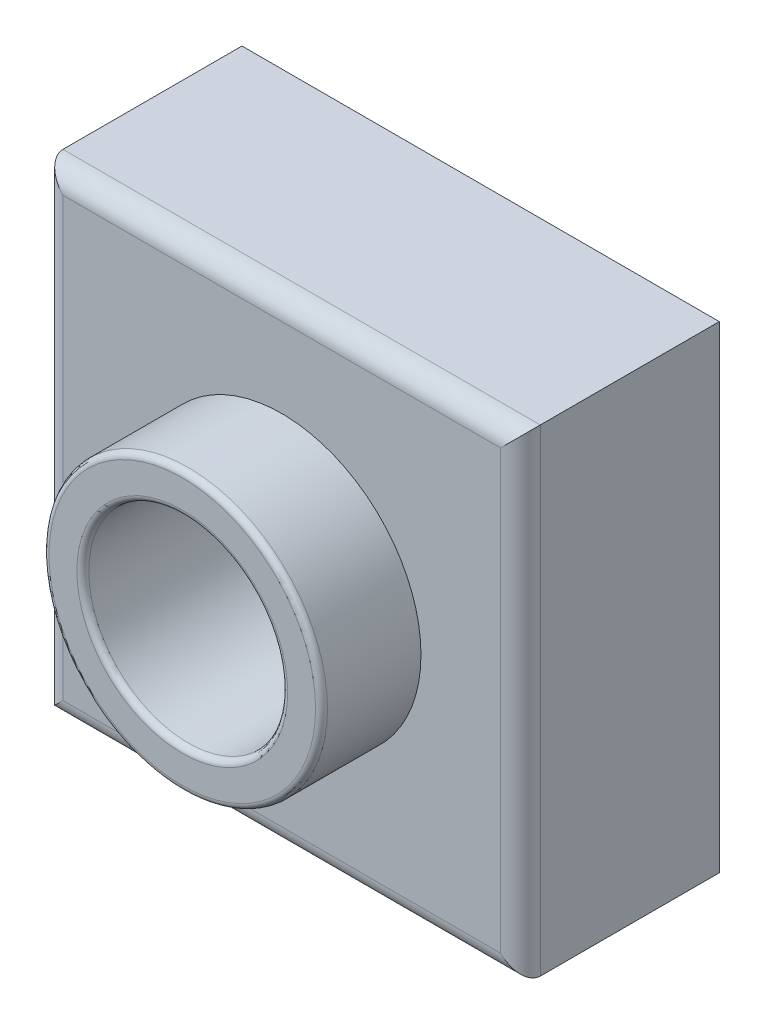
ISO-10303-21;
HEADER;
FILE_DESCRIPTION(('STEP AP214'),'2;1');
FILE_NAME('part.step','',(''),(''),'','','');
FILE_SCHEMA(('AUTOMOTIVE_DESIGN { 1 0 10303 214 1 1 1 1 }'));
ENDSEC;
DATA;
#1=APPLICATION_CONTEXT('core data for automotive mechanical design processes');
#2=APPLICATION_PROTOCOL_DEFINITION('international standard','automotive_design',2000,#1);
#3=PRODUCT_CONTEXT('',#1,'mechanical');
#4=PRODUCT('Part','Part','',(#3));
#5=PRODUCT_RELATED_PRODUCT_CATEGORY('part','',(#4));
#6=PRODUCT_DEFINITION_FORMATION('','',#4);
#7=PRODUCT_DEFINITION_CONTEXT('part definition',#1,'design');
#8=PRODUCT_DEFINITION('design','',#6,#7);
#9=PRODUCT_DEFINITION_SHAPE('','',#8);
#10=(LENGTH_UNIT() NAMED_UNIT(*) SI_UNIT(.MILLI.,.METRE.));
#11=(NAMED_UNIT(*) PLANE_ANGLE_UNIT() SI_UNIT($,.RADIAN.));
#12=(NAMED_UNIT(*) SI_UNIT($,.STERADIAN.) SOLID_ANGLE_UNIT());
#13=UNCERTAINTY_MEASURE_WITH_UNIT(LENGTH_MEASURE(1.E-05),#10,'distance_accuracy_value','');
#14=(GEOMETRIC_REPRESENTATION_CONTEXT(3) GLOBAL_UNCERTAINTY_ASSIGNED_CONTEXT((#13)) GLOBAL_UNIT_ASSIGNED_CONTEXT((#10,
#11,#12)) REPRESENTATION_CONTEXT('',''));
#15=CARTESIAN_POINT('',(0.,0.,0.));
#16=DIRECTION('',(0.,0.,1.));
#17=DIRECTION('',(1.,0.,0.));
#18=AXIS2_PLACEMENT_3D('',#15,#16,#17);
#19=CARTESIAN_POINT('',(0.,0.,0.));
#20=DIRECTION('',(0.,0.,1.));
#21=DIRECTION('',(1.,0.,0.));
#22=AXIS2_PLACEMENT_3D('',#19,#20,#21);
#23=PLANE('',#22);
#24=CARTESIAN_POINT('',(-60.,60.,0.));
#25=DIRECTION('',(0.,0.,1.));
#26=DIRECTION('',(1.,0.,0.));
#27=AXIS2_PLACEMENT_3D('',#24,#25,#26);
#28=CIRCLE('',#27,25.);
#29=CARTESIAN_POINT('',(-35.,60.,0.));
#30=VERTEX_POINT('',#29);
#31=EDGE_CURVE('E193',#30,#30,#28,.T.);
#32=ORIENTED_EDGE('',*,*,#31,.T.);
#33=EDGE_LOOP('',(#32));
#34=FACE_BOUND('',#33,.T.);
#35=CARTESIAN_POINT('',(-60.,60.,0.));
#36=DIRECTION('',(0.,0.,1.));
#37=DIRECTION('',(1.,0.,0.));
#38=AXIS2_PLACEMENT_3D('',#35,#36,#37);
#39=CIRCLE('',#38,27.);
#40=CARTESIAN_POINT('',(-33.,60.,0.));
#41=VERTEX_POINT('',#40);
#42=EDGE_CURVE('E181',#41,#41,#39,.T.);
#43=ORIENTED_EDGE('',*,*,#42,.F.);
#44=EDGE_LOOP('',(#43));
#45=FACE_BOUND('',#44,.T.);
#46=ADVANCED_FACE('F39',(#34,#45),#23,.F.);
#47=CARTESIAN_POINT('',(0.,0.,50.));
#48=DIRECTION('',(-1.,0.,0.));
#49=DIRECTION('',(0.,-1.,0.));
#50=AXIS2_PLACEMENT_3D('',#47,#48,#49);
#51=PLANE('',#50);
#52=DIRECTION('',(0.,0.,-1.));
#53=VECTOR('',#52,1.);
#54=CARTESIAN_POINT('',(0.,120.,50.));
#55=LINE('',#54,#53);
#56=CARTESIAN_POINT('',(0.,120.,45.));
#57=VERTEX_POINT('',#56);
#58=CARTESIAN_POINT('',(0.,120.,0.));
#59=VERTEX_POINT('',#58);
#60=EDGE_CURVE('E204',#57,#59,#55,.T.);
#61=ORIENTED_EDGE('',*,*,#60,.F.);
#62=DIRECTION('',(0.,1.,0.));
#63=VECTOR('',#62,1.);
#64=CARTESIAN_POINT('',(0.,0.,45.));
#65=LINE('',#64,#63);
#66=CARTESIAN_POINT('',(0.,0.,45.));
#67=VERTEX_POINT('',#66);
#68=EDGE_CURVE('E252',#57,#67,#65,.F.);
#69=ORIENTED_EDGE('',*,*,#68,.T.);
#70=DIRECTION('',(0.,0.,-1.));
#71=VECTOR('',#70,1.);
#72=CARTESIAN_POINT('',(0.,0.,50.));
#73=LINE('',#72,#71);
#74=CARTESIAN_POINT('',(0.,0.,0.));
#75=VERTEX_POINT('',#74);
#76=EDGE_CURVE('E220',#67,#75,#73,.T.);
#77=ORIENTED_EDGE('',*,*,#76,.T.);
#78=DIRECTION('',(0.,1.,0.));
#79=VECTOR('',#78,1.);
#80=CARTESIAN_POINT('',(0.,0.,0.));
#81=LINE('',#80,#79);
#82=EDGE_CURVE('E197',#75,#59,#81,.T.);
#83=ORIENTED_EDGE('',*,*,#82,.T.);
#84=EDGE_LOOP('',(#61,#69,#77,#83));
#85=FACE_BOUND('',#84,.T.);
#86=ADVANCED_FACE('F308',(#85),#51,.F.);
#87=CARTESIAN_POINT('',(0.,120.,50.));
#88=DIRECTION('',(0.,-1.,0.));
#89=DIRECTION('',(1.,0.,0.));
#90=AXIS2_PLACEMENT_3D('',#87,#88,#89);
#91=PLANE('',#90);
#92=DIRECTION('',(0.,0.,-1.));
#93=VECTOR('',#92,1.);
#94=CARTESIAN_POINT('',(-120.,120.,50.));
#95=LINE('',#94,#93);
#96=CARTESIAN_POINT('',(-120.,120.,45.));
#97=VERTEX_POINT('',#96);
#98=CARTESIAN_POINT('',(-120.,120.,0.));
#99=VERTEX_POINT('',#98);
#100=EDGE_CURVE('E226',#97,#99,#95,.T.);
#101=ORIENTED_EDGE('',*,*,#100,.F.);
#102=DIRECTION('',(-1.,0.,0.));
#103=VECTOR('',#102,1.);
#104=CARTESIAN_POINT('',(0.,120.,45.));
#105=LINE('',#104,#103);
#106=EDGE_CURVE('E63',#97,#57,#105,.F.);
#107=ORIENTED_EDGE('',*,*,#106,.T.);
#108=ORIENTED_EDGE('',*,*,#60,.T.);
#109=DIRECTION('',(-1.,0.,0.));
#110=VECTOR('',#109,1.);
#111=CARTESIAN_POINT('',(0.,120.,0.));
#112=LINE('',#111,#110);
#113=EDGE_CURVE('E208',#59,#99,#112,.T.);
#114=ORIENTED_EDGE('',*,*,#113,.T.);
#115=EDGE_LOOP('',(#101,#107,#108,#114));
#116=FACE_BOUND('',#115,.T.);
#117=ADVANCED_FACE('F354',(#116),#91,.F.);
#118=CARTESIAN_POINT('',(-120.,0.,50.));
#119=DIRECTION('',(1.,0.,0.));
#120=DIRECTION('',(0.,0.,-1.));
#121=AXIS2_PLACEMENT_3D('',#118,#119,#120);
#122=PLANE('',#121);
#123=DIRECTION('',(0.,0.,-1.));
#124=VECTOR('',#123,1.);
#125=CARTESIAN_POINT('',(-120.,0.,50.));
#126=LINE('',#125,#124);
#127=CARTESIAN_POINT('',(-120.,0.,45.));
#128=VERTEX_POINT('',#127);
#129=CARTESIAN_POINT('',(-120.,0.,0.));
#130=VERTEX_POINT('',#129);
#131=EDGE_CURVE('E223',#128,#130,#126,.T.);
#132=ORIENTED_EDGE('',*,*,#131,.F.);
#133=DIRECTION('',(0.,-1.,0.));
#134=VECTOR('',#133,1.);
#135=CARTESIAN_POINT('',(-120.,120.,45.));
#136=LINE('',#135,#134);
#137=EDGE_CURVE('E247',#128,#97,#136,.F.);
#138=ORIENTED_EDGE('',*,*,#137,.T.);
#139=ORIENTED_EDGE('',*,*,#100,.T.);
#140=DIRECTION('',(0.,-1.,0.));
#141=VECTOR('',#140,1.);
#142=CARTESIAN_POINT('',(-120.,0.,0.));
#143=LINE('',#142,#141);
#144=EDGE_CURVE('E212',#99,#130,#143,.T.);
#145=ORIENTED_EDGE('',*,*,#144,.T.);
#146=EDGE_LOOP('',(#132,#138,#139,#145));
#147=FACE_BOUND('',#146,.T.);
#148=ADVANCED_FACE('F350',(#147),#122,.F.);
#149=CARTESIAN_POINT('',(0.,0.,50.));
#150=DIRECTION('',(0.,1.,0.));
#151=DIRECTION('',(-1.,0.,0.));
#152=AXIS2_PLACEMENT_3D('',#149,#150,#151);
#153=PLANE('',#152);
#154=ORIENTED_EDGE('',*,*,#76,.F.);
#155=DIRECTION('',(1.,0.,0.));
#156=VECTOR('',#155,1.);
#157=CARTESIAN_POINT('',(-120.,0.,45.));
#158=LINE('',#157,#156);
#159=EDGE_CURVE('E243',#67,#128,#158,.F.);
#160=ORIENTED_EDGE('',*,*,#159,.T.);
#161=ORIENTED_EDGE('',*,*,#131,.T.);
#162=DIRECTION('',(1.,0.,0.));
#163=VECTOR('',#162,1.);
#164=CARTESIAN_POINT('',(0.,0.,0.));
#165=LINE('',#164,#163);
#166=EDGE_CURVE('E216',#130,#75,#165,.T.);
#167=ORIENTED_EDGE('',*,*,#166,.T.);
#168=EDGE_LOOP('',(#154,#160,#161,#167));
#169=FACE_BOUND('',#168,.T.);
#170=ADVANCED_FACE('F343',(#169),#153,.F.);
#171=CARTESIAN_POINT('',(0.,0.,50.));
#172=DIRECTION('',(0.,0.,1.));
#173=DIRECTION('',(1.,0.,0.));
#174=AXIS2_PLACEMENT_3D('',#171,#172,#173);
#175=PLANE('',#174);
#176=DIRECTION('',(0.,-1.,0.));
#177=VECTOR('',#176,1.);
#178=CARTESIAN_POINT('',(-115.,0.,50.));
#179=LINE('',#178,#177);
#180=CARTESIAN_POINT('',(-115.,115.,50.));
#181=VERTEX_POINT('',#180);
#182=CARTESIAN_POINT('',(-115.,4.99999999999999,50.));
#183=VERTEX_POINT('',#182);
#184=EDGE_CURVE('E236',#181,#183,#179,.T.);
#185=ORIENTED_EDGE('',*,*,#184,.T.);
#186=DIRECTION('',(1.,0.,0.));
#187=VECTOR('',#186,1.);
#188=CARTESIAN_POINT('',(0.,5.,50.));
#189=LINE('',#188,#187);
#190=CARTESIAN_POINT('',(-5.,5.,50.));
#191=VERTEX_POINT('',#190);
#192=EDGE_CURVE('E239',#183,#191,#189,.T.);
#193=ORIENTED_EDGE('',*,*,#192,.T.);
#194=DIRECTION('',(0.,1.,0.));
#195=VECTOR('',#194,1.);
#196=CARTESIAN_POINT('',(-5.,120.,50.));
#197=LINE('',#196,#195);
#198=CARTESIAN_POINT('',(-5.,115.,50.));
#199=VERTEX_POINT('',#198);
#200=EDGE_CURVE('E203',#191,#199,#197,.T.);
#201=ORIENTED_EDGE('',*,*,#200,.T.);
#202=DIRECTION('',(-1.,0.,0.));
#203=VECTOR('',#202,1.);
#204=CARTESIAN_POINT('',(-120.,115.,50.));
#205=LINE('',#204,#203);
#206=EDGE_CURVE('E233',#199,#181,#205,.T.);
#207=ORIENTED_EDGE('',*,*,#206,.T.);
#208=EDGE_LOOP('',(#185,#193,#201,#207));
#209=FACE_BOUND('',#208,.T.);
#210=CARTESIAN_POINT('',(-60.,60.,50.));
#211=DIRECTION('',(0.,0.,1.));
#212=DIRECTION('',(1.,0.,0.));
#213=AXIS2_PLACEMENT_3D('',#210,#211,#212);
#214=CIRCLE('',#213,35.);
#215=CARTESIAN_POINT('',(-25.,60.,50.));
#216=VERTEX_POINT('',#215);
#217=EDGE_CURVE('E199',#216,#216,#214,.T.);
#218=ORIENTED_EDGE('',*,*,#217,.F.);
#219=EDGE_LOOP('',(#218));
#220=FACE_BOUND('',#219,.T.);
#221=ADVANCED_FACE('F341',(#209,#220),#175,.T.);
#222=DIRECTION('',(1.,0.,0.));
#223=VECTOR('',#222,1.);
#224=CARTESIAN_POINT('',(0.,2.,0.));
#225=LINE('',#224,#223);
#226=CARTESIAN_POINT('',(-118.,1.99999999999999,0.));
#227=VERTEX_POINT('',#226);
#228=CARTESIAN_POINT('',(-2.,2.,0.));
#229=VERTEX_POINT('',#228);
#230=EDGE_CURVE('E155',#227,#229,#225,.T.);
#231=ORIENTED_EDGE('',*,*,#230,.T.);
#232=DIRECTION('',(0.,1.,0.));
#233=VECTOR('',#232,1.);
#234=CARTESIAN_POINT('',(-2.,0.,0.));
#235=LINE('',#234,#233);
#236=CARTESIAN_POINT('',(-2.,118.,0.));
#237=VERTEX_POINT('',#236);
#238=EDGE_CURVE('E149',#229,#237,#235,.T.);
#239=ORIENTED_EDGE('',*,*,#238,.T.);
#240=DIRECTION('',(-1.,0.,0.));
#241=VECTOR('',#240,1.);
#242=CARTESIAN_POINT('',(0.,118.,0.));
#243=LINE('',#242,#241);
#244=CARTESIAN_POINT('',(-118.,118.,0.));
#245=VERTEX_POINT('',#244);
#246=EDGE_CURVE('E180',#237,#245,#243,.T.);
#247=ORIENTED_EDGE('',*,*,#246,.T.);
#248=DIRECTION('',(0.,-1.,0.));
#249=VECTOR('',#248,1.);
#250=CARTESIAN_POINT('',(-118.,0.,0.));
#251=LINE('',#250,#249);
#252=EDGE_CURVE('E55',#245,#227,#251,.T.);
#253=ORIENTED_EDGE('',*,*,#252,.T.);
#254=EDGE_LOOP('',(#231,#239,#247,#253));
#255=FACE_BOUND('',#254,.T.);
#256=ORIENTED_EDGE('',*,*,#82,.F.);
#257=ORIENTED_EDGE('',*,*,#166,.F.);
#258=ORIENTED_EDGE('',*,*,#144,.F.);
#259=ORIENTED_EDGE('',*,*,#113,.F.);
#260=EDGE_LOOP('',(#256,#257,#258,#259));
#261=FACE_BOUND('',#260,.T.);
#262=ADVANCED_FACE('F310',(#255,#261),#23,.F.);
#263=CARTESIAN_POINT('',(-60.,60.,75.));
#264=DIRECTION('',(0.,0.,-1.));
#265=DIRECTION('',(-1.,0.,0.));
#266=AXIS2_PLACEMENT_3D('',#263,#264,#265);
#267=CYLINDRICAL_SURFACE('',#266,35.);
#268=CARTESIAN_POINT('',(-60.,60.,73.5));
#269=DIRECTION('',(0.,0.,1.));
#270=DIRECTION('',(1.,0.,0.));
#271=AXIS2_PLACEMENT_3D('',#268,#269,#270);
#272=CIRCLE('',#271,35.);
#273=CARTESIAN_POINT('',(-25.,60.,73.5));
#274=VERTEX_POINT('',#273);
#275=EDGE_CURVE('E48',#274,#274,#272,.F.);
#276=ORIENTED_EDGE('',*,*,#275,.T.);
#277=EDGE_LOOP('',(#276));
#278=FACE_BOUND('',#277,.T.);
#279=ORIENTED_EDGE('',*,*,#217,.T.);
#280=EDGE_LOOP('',(#279));
#281=FACE_BOUND('',#280,.T.);
#282=ADVANCED_FACE('F280',(#278,#281),#267,.T.);
#283=CARTESIAN_POINT('',(-60.,60.,75.));
#284=DIRECTION('',(0.,0.,1.));
#285=DIRECTION('',(1.,0.,0.));
#286=AXIS2_PLACEMENT_3D('',#283,#284,#285);
#287=PLANE('',#286);
#288=CARTESIAN_POINT('',(-60.,60.,75.));
#289=DIRECTION('',(0.,0.,1.));
#290=DIRECTION('',(1.,0.,0.));
#291=AXIS2_PLACEMENT_3D('',#288,#289,#290);
#292=CIRCLE('',#291,33.5);
#293=CARTESIAN_POINT('',(-26.5,60.,75.));
#294=VERTEX_POINT('',#293);
#295=EDGE_CURVE('E273',#294,#294,#292,.T.);
#296=ORIENTED_EDGE('',*,*,#295,.T.);
#297=EDGE_LOOP('',(#296));
#298=FACE_BOUND('',#297,.T.);
#299=CARTESIAN_POINT('',(-60.,60.,75.));
#300=DIRECTION('',(0.,0.,1.));
#301=DIRECTION('',(1.,0.,0.));
#302=AXIS2_PLACEMENT_3D('',#299,#300,#301);
#303=CIRCLE('',#302,26.5);
#304=CARTESIAN_POINT('',(-33.5,60.,75.));
#305=VERTEX_POINT('',#304);
#306=EDGE_CURVE('E255',#305,#305,#303,.F.);
#307=ORIENTED_EDGE('',*,*,#306,.T.);
#308=EDGE_LOOP('',(#307));
#309=FACE_BOUND('',#308,.T.);
#310=ADVANCED_FACE('F289',(#298,#309),#287,.T.);
#311=CARTESIAN_POINT('',(-60.,60.,0.));
#312=DIRECTION('',(0.,0.,1.));
#313=DIRECTION('',(1.,0.,0.));
#314=AXIS2_PLACEMENT_3D('',#311,#312,#313);
#315=CYLINDRICAL_SURFACE('',#314,25.);
#316=CARTESIAN_POINT('',(-60.,60.,73.5));
#317=DIRECTION('',(0.,0.,1.));
#318=DIRECTION('',(1.,0.,0.));
#319=AXIS2_PLACEMENT_3D('',#316,#317,#318);
#320=CIRCLE('',#319,25.);
#321=CARTESIAN_POINT('',(-35.,60.,73.5));
#322=VERTEX_POINT('',#321);
#323=EDGE_CURVE('E11',#322,#322,#320,.T.);
#324=ORIENTED_EDGE('',*,*,#323,.T.);
#325=EDGE_LOOP('',(#324));
#326=FACE_BOUND('',#325,.T.);
#327=ORIENTED_EDGE('',*,*,#31,.F.);
#328=EDGE_LOOP('',(#327));
#329=FACE_BOUND('',#328,.T.);
#330=ADVANCED_FACE('F292',(#326,#329),#315,.F.);
#331=CARTESIAN_POINT('',(0.,115.,45.));
#332=DIRECTION('',(1.,0.,0.));
#333=DIRECTION('',(0.,1.,0.));
#334=AXIS2_PLACEMENT_3D('',#331,#332,#333);
#335=CYLINDRICAL_SURFACE('',#334,5.);
#336=CARTESIAN_POINT('',(-5.,115.,45.));
#337=DIRECTION('',(0.707106781186548,-0.707106781186547,0.));
#338=DIRECTION('',(-0.707106781186547,-0.707106781186548,0.));
#339=AXIS2_PLACEMENT_3D('',#336,#337,#338);
#340=ELLIPSE('',#339,7.07106781186548,5.);
#341=EDGE_CURVE('E263',#57,#199,#340,.T.);
#342=ORIENTED_EDGE('',*,*,#341,.F.);
#343=ORIENTED_EDGE('',*,*,#106,.F.);
#344=CARTESIAN_POINT('',(-115.,115.,45.));
#345=DIRECTION('',(0.707106781186547,0.707106781186548,0.));
#346=DIRECTION('',(0.707106781186548,-0.707106781186547,0.));
#347=AXIS2_PLACEMENT_3D('',#344,#345,#346);
#348=ELLIPSE('',#347,7.07106781186547,5.);
#349=EDGE_CURVE('E198',#181,#97,#348,.F.);
#350=ORIENTED_EDGE('',*,*,#349,.F.);
#351=ORIENTED_EDGE('',*,*,#206,.F.);
#352=EDGE_LOOP('',(#342,#343,#350,#351));
#353=FACE_BOUND('',#352,.T.);
#354=ADVANCED_FACE('F302',(#353),#335,.T.);
#355=CARTESIAN_POINT('',(-115.,0.,45.));
#356=DIRECTION('',(0.,1.,0.));
#357=DIRECTION('',(0.,0.,1.));
#358=AXIS2_PLACEMENT_3D('',#355,#356,#357);
#359=CYLINDRICAL_SURFACE('',#358,5.);
#360=ORIENTED_EDGE('',*,*,#349,.T.);
#361=ORIENTED_EDGE('',*,*,#137,.F.);
#362=CARTESIAN_POINT('',(-115.,4.99999999999999,45.));
#363=DIRECTION('',(-0.707106781186548,0.707106781186547,0.));
#364=DIRECTION('',(0.707106781186547,0.707106781186548,0.));
#365=AXIS2_PLACEMENT_3D('',#362,#363,#364);
#366=ELLIPSE('',#365,7.07106781186548,5.);
#367=EDGE_CURVE('E259',#183,#128,#366,.F.);
#368=ORIENTED_EDGE('',*,*,#367,.F.);
#369=ORIENTED_EDGE('',*,*,#184,.F.);
#370=EDGE_LOOP('',(#360,#361,#368,#369));
#371=FACE_BOUND('',#370,.T.);
#372=ADVANCED_FACE('F367',(#371),#359,.T.);
#373=CARTESIAN_POINT('',(-5.,0.,45.));
#374=DIRECTION('',(0.,-1.,0.));
#375=DIRECTION('',(1.,0.,0.));
#376=AXIS2_PLACEMENT_3D('',#373,#374,#375);
#377=CYLINDRICAL_SURFACE('',#376,5.);
#378=ORIENTED_EDGE('',*,*,#341,.T.);
#379=ORIENTED_EDGE('',*,*,#200,.F.);
#380=CARTESIAN_POINT('',(-5.,5.,45.));
#381=DIRECTION('',(-0.707106781186547,-0.707106781186548,0.));
#382=DIRECTION('',(0.707106781186548,-0.707106781186547,0.));
#383=AXIS2_PLACEMENT_3D('',#380,#381,#382);
#384=ELLIPSE('',#383,7.07106781186547,5.);
#385=EDGE_CURVE('E256',#67,#191,#384,.T.);
#386=ORIENTED_EDGE('',*,*,#385,.F.);
#387=ORIENTED_EDGE('',*,*,#68,.F.);
#388=EDGE_LOOP('',(#378,#379,#386,#387));
#389=FACE_BOUND('',#388,.T.);
#390=ADVANCED_FACE('F363',(#389),#377,.T.);
#391=CARTESIAN_POINT('',(0.,5.,45.));
#392=DIRECTION('',(-1.,0.,0.));
#393=DIRECTION('',(0.,-1.,0.));
#394=AXIS2_PLACEMENT_3D('',#391,#392,#393);
#395=CYLINDRICAL_SURFACE('',#394,5.);
#396=ORIENTED_EDGE('',*,*,#367,.T.);
#397=ORIENTED_EDGE('',*,*,#159,.F.);
#398=ORIENTED_EDGE('',*,*,#385,.T.);
#399=ORIENTED_EDGE('',*,*,#192,.F.);
#400=EDGE_LOOP('',(#396,#397,#398,#399));
#401=FACE_BOUND('',#400,.T.);
#402=ADVANCED_FACE('F286',(#401),#395,.T.);
#403=CARTESIAN_POINT('',(-60.,60.,73.5));
#404=DIRECTION('',(0.,0.,1.));
#405=DIRECTION('',(1.,0.,0.));
#406=AXIS2_PLACEMENT_3D('',#403,#404,#405);
#407=TOROIDAL_SURFACE('',#406,33.5,1.5);
#408=ORIENTED_EDGE('',*,*,#275,.F.);
#409=EDGE_LOOP('',(#408));
#410=FACE_BOUND('',#409,.T.);
#411=ORIENTED_EDGE('',*,*,#295,.F.);
#412=EDGE_LOOP('',(#411));
#413=FACE_BOUND('',#412,.T.);
#414=ADVANCED_FACE('F283',(#410,#413),#407,.T.);
#415=CARTESIAN_POINT('',(-60.,60.,73.5));
#416=DIRECTION('',(0.,0.,1.));
#417=DIRECTION('',(1.,0.,0.));
#418=AXIS2_PLACEMENT_3D('',#415,#416,#417);
#419=TOROIDAL_SURFACE('',#418,26.5,1.5);
#420=ORIENTED_EDGE('',*,*,#306,.F.);
#421=EDGE_LOOP('',(#420));
#422=FACE_BOUND('',#421,.T.);
#423=ORIENTED_EDGE('',*,*,#323,.F.);
#424=EDGE_LOOP('',(#423));
#425=FACE_BOUND('',#424,.T.);
#426=ADVANCED_FACE('F41',(#422,#425),#419,.T.);
#427=CARTESIAN_POINT('',(-2.,0.,50.));
#428=DIRECTION('',(-1.,0.,0.));
#429=DIRECTION('',(0.,-1.,0.));
#430=AXIS2_PLACEMENT_3D('',#427,#428,#429);
#431=PLANE('',#430);
#432=DIRECTION('',(0.,0.,-1.));
#433=VECTOR('',#432,1.);
#434=CARTESIAN_POINT('',(-2.,118.,50.));
#435=LINE('',#434,#433);
#436=CARTESIAN_POINT('',(-2.,118.,45.));
#437=VERTEX_POINT('',#436);
#438=EDGE_CURVE('E586',#437,#237,#435,.T.);
#439=ORIENTED_EDGE('',*,*,#438,.T.);
#440=ORIENTED_EDGE('',*,*,#238,.F.);
#441=DIRECTION('',(0.,0.,-1.));
#442=VECTOR('',#441,1.);
#443=CARTESIAN_POINT('',(-2.,2.,50.));
#444=LINE('',#443,#442);
#445=CARTESIAN_POINT('',(-2.,2.,45.));
#446=VERTEX_POINT('',#445);
#447=EDGE_CURVE('E145',#446,#229,#444,.T.);
#448=ORIENTED_EDGE('',*,*,#447,.F.);
#449=DIRECTION('',(0.,-1.,0.));
#450=VECTOR('',#449,1.);
#451=CARTESIAN_POINT('',(-2.,0.,45.));
#452=LINE('',#451,#450);
#453=EDGE_CURVE('E131',#437,#446,#452,.T.);
#454=ORIENTED_EDGE('',*,*,#453,.F.);
#455=EDGE_LOOP('',(#439,#440,#448,#454));
#456=FACE_BOUND('',#455,.T.);
#457=ADVANCED_FACE('F147',(#456),#431,.T.);
#458=CARTESIAN_POINT('',(0.,118.,50.));
#459=DIRECTION('',(0.,-1.,0.));
#460=DIRECTION('',(1.,0.,0.));
#461=AXIS2_PLACEMENT_3D('',#458,#459,#460);
#462=PLANE('',#461);
#463=DIRECTION('',(0.,0.,-1.));
#464=VECTOR('',#463,1.);
#465=CARTESIAN_POINT('',(-118.,118.,50.));
#466=LINE('',#465,#464);
#467=CARTESIAN_POINT('',(-118.,118.,45.));
#468=VERTEX_POINT('',#467);
#469=EDGE_CURVE('E592',#468,#245,#466,.T.);
#470=ORIENTED_EDGE('',*,*,#469,.T.);
#471=ORIENTED_EDGE('',*,*,#246,.F.);
#472=ORIENTED_EDGE('',*,*,#438,.F.);
#473=DIRECTION('',(1.,0.,0.));
#474=VECTOR('',#473,1.);
#475=CARTESIAN_POINT('',(0.,118.,45.));
#476=LINE('',#475,#474);
#477=EDGE_CURVE('E142',#468,#437,#476,.T.);
#478=ORIENTED_EDGE('',*,*,#477,.F.);
#479=EDGE_LOOP('',(#470,#471,#472,#478));
#480=FACE_BOUND('',#479,.T.);
#481=ADVANCED_FACE('F427',(#480),#462,.T.);
#482=CARTESIAN_POINT('',(-118.,0.,50.));
#483=DIRECTION('',(1.,0.,0.));
#484=DIRECTION('',(0.,0.,-1.));
#485=AXIS2_PLACEMENT_3D('',#482,#483,#484);
#486=PLANE('',#485);
#487=DIRECTION('',(0.,0.,-1.));
#488=VECTOR('',#487,1.);
#489=CARTESIAN_POINT('',(-118.,1.99999999999999,50.));
#490=LINE('',#489,#488);
#491=CARTESIAN_POINT('',(-118.,1.99999999999998,45.));
#492=VERTEX_POINT('',#491);
#493=EDGE_CURVE('E154',#492,#227,#490,.T.);
#494=ORIENTED_EDGE('',*,*,#493,.T.);
#495=ORIENTED_EDGE('',*,*,#252,.F.);
#496=ORIENTED_EDGE('',*,*,#469,.F.);
#497=DIRECTION('',(0.,1.,0.));
#498=VECTOR('',#497,1.);
#499=CARTESIAN_POINT('',(-118.,0.,45.));
#500=LINE('',#499,#498);
#501=EDGE_CURVE('E164',#492,#468,#500,.T.);
#502=ORIENTED_EDGE('',*,*,#501,.F.);
#503=EDGE_LOOP('',(#494,#495,#496,#502));
#504=FACE_BOUND('',#503,.T.);
#505=ADVANCED_FACE('F435',(#504),#486,.T.);
#506=CARTESIAN_POINT('',(0.,2.,50.));
#507=DIRECTION('',(0.,1.,0.));
#508=DIRECTION('',(-1.,0.,0.));
#509=AXIS2_PLACEMENT_3D('',#506,#507,#508);
#510=PLANE('',#509);
#511=ORIENTED_EDGE('',*,*,#447,.T.);
#512=ORIENTED_EDGE('',*,*,#230,.F.);
#513=ORIENTED_EDGE('',*,*,#493,.F.);
#514=DIRECTION('',(-1.,0.,0.));
#515=VECTOR('',#514,1.);
#516=CARTESIAN_POINT('',(0.,2.,45.));
#517=LINE('',#516,#515);
#518=EDGE_CURVE('E159',#446,#492,#517,.T.);
#519=ORIENTED_EDGE('',*,*,#518,.F.);
#520=EDGE_LOOP('',(#511,#512,#513,#519));
#521=FACE_BOUND('',#520,.T.);
#522=ADVANCED_FACE('F160',(#521),#510,.T.);
#523=CARTESIAN_POINT('',(0.,0.,48.));
#524=DIRECTION('',(0.,0.,1.));
#525=DIRECTION('',(1.,0.,0.));
#526=AXIS2_PLACEMENT_3D('',#523,#524,#525);
#527=PLANE('',#526);
#528=DIRECTION('',(0.,1.,0.));
#529=VECTOR('',#528,1.);
#530=CARTESIAN_POINT('',(-115.,0.,48.));
#531=LINE('',#530,#529);
#532=CARTESIAN_POINT('',(-115.,115.,48.));
#533=VERTEX_POINT('',#532);
#534=CARTESIAN_POINT('',(-115.,4.99999999999999,48.));
#535=VERTEX_POINT('',#534);
#536=EDGE_CURVE('E606',#533,#535,#531,.F.);
#537=ORIENTED_EDGE('',*,*,#536,.F.);
#538=DIRECTION('',(1.,0.,0.));
#539=VECTOR('',#538,1.);
#540=CARTESIAN_POINT('',(0.,115.,48.));
#541=LINE('',#540,#539);
#542=CARTESIAN_POINT('',(-5.,115.,48.));
#543=VERTEX_POINT('',#542);
#544=EDGE_CURVE('E590',#543,#533,#541,.F.);
#545=ORIENTED_EDGE('',*,*,#544,.F.);
#546=DIRECTION('',(0.,1.,0.));
#547=VECTOR('',#546,1.);
#548=CARTESIAN_POINT('',(-5.,0.,48.));
#549=LINE('',#548,#547);
#550=CARTESIAN_POINT('',(-5.,5.,48.));
#551=VERTEX_POINT('',#550);
#552=EDGE_CURVE('E585',#551,#543,#549,.T.);
#553=ORIENTED_EDGE('',*,*,#552,.F.);
#554=DIRECTION('',(1.,0.,0.));
#555=VECTOR('',#554,1.);
#556=CARTESIAN_POINT('',(0.,4.99999999999999,48.));
#557=LINE('',#556,#555);
#558=EDGE_CURVE('E165',#535,#551,#557,.T.);
#559=ORIENTED_EDGE('',*,*,#558,.F.);
#560=EDGE_LOOP('',(#537,#545,#553,#559));
#561=FACE_BOUND('',#560,.T.);
#562=CARTESIAN_POINT('',(-60.,60.,48.));
#563=DIRECTION('',(0.,0.,1.));
#564=DIRECTION('',(1.,0.,0.));
#565=AXIS2_PLACEMENT_3D('',#562,#563,#564);
#566=CIRCLE('',#565,33.);
#567=CARTESIAN_POINT('',(-27.,60.,48.));
#568=VERTEX_POINT('',#567);
#569=EDGE_CURVE('E582',#568,#568,#566,.T.);
#570=ORIENTED_EDGE('',*,*,#569,.T.);
#571=EDGE_LOOP('',(#570));
#572=FACE_BOUND('',#571,.T.);
#573=ADVANCED_FACE('F449',(#561,#572),#527,.F.);
#574=CARTESIAN_POINT('',(-60.,60.,75.));
#575=DIRECTION('',(0.,0.,-1.));
#576=DIRECTION('',(-1.,0.,0.));
#577=AXIS2_PLACEMENT_3D('',#574,#575,#576);
#578=CYLINDRICAL_SURFACE('',#577,33.);
#579=CARTESIAN_POINT('',(-60.,60.,73.));
#580=DIRECTION('',(0.,0.,1.));
#581=DIRECTION('',(1.,0.,0.));
#582=AXIS2_PLACEMENT_3D('',#579,#580,#581);
#583=CIRCLE('',#582,33.);
#584=CARTESIAN_POINT('',(-27.,60.,73.));
#585=VERTEX_POINT('',#584);
#586=EDGE_CURVE('E141',#585,#585,#583,.T.);
#587=ORIENTED_EDGE('',*,*,#586,.T.);
#588=EDGE_LOOP('',(#587));
#589=FACE_BOUND('',#588,.T.);
#590=ORIENTED_EDGE('',*,*,#569,.F.);
#591=EDGE_LOOP('',(#590));
#592=FACE_BOUND('',#591,.T.);
#593=ADVANCED_FACE('F326',(#589,#592),#578,.F.);
#594=CARTESIAN_POINT('',(-60.,60.,73.));
#595=DIRECTION('',(0.,0.,1.));
#596=DIRECTION('',(1.,0.,0.));
#597=AXIS2_PLACEMENT_3D('',#594,#595,#596);
#598=PLANE('',#597);
#599=ORIENTED_EDGE('',*,*,#586,.F.);
#600=EDGE_LOOP('',(#599));
#601=FACE_BOUND('',#600,.T.);
#602=CARTESIAN_POINT('',(-60.,60.,73.));
#603=DIRECTION('',(0.,0.,1.));
#604=DIRECTION('',(1.,0.,0.));
#605=AXIS2_PLACEMENT_3D('',#602,#603,#604);
#606=CIRCLE('',#605,27.);
#607=CARTESIAN_POINT('',(-33.,60.,73.));
#608=VERTEX_POINT('',#607);
#609=EDGE_CURVE('E260',#608,#608,#606,.T.);
#610=ORIENTED_EDGE('',*,*,#609,.T.);
#611=EDGE_LOOP('',(#610));
#612=FACE_BOUND('',#611,.T.);
#613=ADVANCED_FACE('F316',(#601,#612),#598,.F.);
#614=CARTESIAN_POINT('',(-60.,60.,0.));
#615=DIRECTION('',(0.,0.,1.));
#616=DIRECTION('',(1.,0.,0.));
#617=AXIS2_PLACEMENT_3D('',#614,#615,#616);
#618=CYLINDRICAL_SURFACE('',#617,27.);
#619=ORIENTED_EDGE('',*,*,#609,.F.);
#620=EDGE_LOOP('',(#619));
#621=FACE_BOUND('',#620,.T.);
#622=ORIENTED_EDGE('',*,*,#42,.T.);
#623=EDGE_LOOP('',(#622));
#624=FACE_BOUND('',#623,.T.);
#625=ADVANCED_FACE('F313',(#621,#624),#618,.T.);
#626=CARTESIAN_POINT('',(0.,115.,45.));
#627=DIRECTION('',(1.,0.,0.));
#628=DIRECTION('',(0.,1.,0.));
#629=AXIS2_PLACEMENT_3D('',#626,#627,#628);
#630=CYLINDRICAL_SURFACE('',#629,3.);
#631=CARTESIAN_POINT('',(-5.,115.,45.));
#632=DIRECTION('',(0.707106781186548,-0.707106781186547,0.));
#633=DIRECTION('',(-0.707106781186547,-0.707106781186548,0.));
#634=AXIS2_PLACEMENT_3D('',#631,#632,#633);
#635=ELLIPSE('',#634,4.24264068711929,3.);
#636=EDGE_CURVE('E138',#437,#543,#635,.T.);
#637=ORIENTED_EDGE('',*,*,#636,.T.);
#638=ORIENTED_EDGE('',*,*,#544,.T.);
#639=CARTESIAN_POINT('',(-115.,115.,45.));
#640=DIRECTION('',(0.707106781186547,0.707106781186548,0.));
#641=DIRECTION('',(-0.707106781186548,0.707106781186547,0.));
#642=AXIS2_PLACEMENT_3D('',#639,#640,#641);
#643=ELLIPSE('',#642,4.24264068711928,3.);
#644=EDGE_CURVE('E192',#533,#468,#643,.F.);
#645=ORIENTED_EDGE('',*,*,#644,.T.);
#646=ORIENTED_EDGE('',*,*,#477,.T.);
#647=EDGE_LOOP('',(#637,#638,#645,#646));
#648=FACE_BOUND('',#647,.T.);
#649=ADVANCED_FACE('F315',(#648),#630,.F.);
#650=CARTESIAN_POINT('',(-115.,0.,45.));
#651=DIRECTION('',(0.,1.,0.));
#652=DIRECTION('',(0.,0.,1.));
#653=AXIS2_PLACEMENT_3D('',#650,#651,#652);
#654=CYLINDRICAL_SURFACE('',#653,3.);
#655=ORIENTED_EDGE('',*,*,#644,.F.);
#656=ORIENTED_EDGE('',*,*,#536,.T.);
#657=CARTESIAN_POINT('',(-115.,4.99999999999999,45.));
#658=DIRECTION('',(-0.707106781186548,0.707106781186547,0.));
#659=DIRECTION('',(-0.707106781186547,-0.707106781186548,0.));
#660=AXIS2_PLACEMENT_3D('',#657,#658,#659);
#661=ELLIPSE('',#660,4.24264068711929,3.);
#662=EDGE_CURVE('E171',#535,#492,#661,.F.);
#663=ORIENTED_EDGE('',*,*,#662,.T.);
#664=ORIENTED_EDGE('',*,*,#501,.T.);
#665=EDGE_LOOP('',(#655,#656,#663,#664));
#666=FACE_BOUND('',#665,.T.);
#667=ADVANCED_FACE('F323',(#666),#654,.F.);
#668=CARTESIAN_POINT('',(-5.,0.,45.));
#669=DIRECTION('',(0.,-1.,0.));
#670=DIRECTION('',(1.,0.,0.));
#671=AXIS2_PLACEMENT_3D('',#668,#669,#670);
#672=CYLINDRICAL_SURFACE('',#671,3.);
#673=ORIENTED_EDGE('',*,*,#636,.F.);
#674=ORIENTED_EDGE('',*,*,#453,.T.);
#675=CARTESIAN_POINT('',(-5.,5.,45.));
#676=DIRECTION('',(-0.707106781186547,-0.707106781186548,0.));
#677=DIRECTION('',(-0.707106781186548,0.707106781186547,0.));
#678=AXIS2_PLACEMENT_3D('',#675,#676,#677);
#679=ELLIPSE('',#678,4.24264068711928,3.);
#680=EDGE_CURVE('E135',#446,#551,#679,.T.);
#681=ORIENTED_EDGE('',*,*,#680,.T.);
#682=ORIENTED_EDGE('',*,*,#552,.T.);
#683=EDGE_LOOP('',(#673,#674,#681,#682));
#684=FACE_BOUND('',#683,.T.);
#685=ADVANCED_FACE('F133',(#684),#672,.F.);
#686=CARTESIAN_POINT('',(0.,5.,45.));
#687=DIRECTION('',(-1.,0.,0.));
#688=DIRECTION('',(0.,-1.,0.));
#689=AXIS2_PLACEMENT_3D('',#686,#687,#688);
#690=CYLINDRICAL_SURFACE('',#689,3.);
#691=ORIENTED_EDGE('',*,*,#662,.F.);
#692=ORIENTED_EDGE('',*,*,#558,.T.);
#693=ORIENTED_EDGE('',*,*,#680,.F.);
#694=ORIENTED_EDGE('',*,*,#518,.T.);
#695=EDGE_LOOP('',(#691,#692,#693,#694));
#696=FACE_BOUND('',#695,.T.);
#697=ADVANCED_FACE('F168',(#696),#690,.F.);
#698=CLOSED_SHELL('',(#46,#86,#117,#148,#170,#221,#262,#282,#310,#330,#354,#372,#390,#402,#414,
#426,#457,#481,#505,#522,#573,#593,#613,#625,#649,#667,#685,#697));
#699=MANIFOLD_SOLID_BREP('B2',#698);
#700=ADVANCED_BREP_SHAPE_REPRESENTATION('',(#18,#699),#14);
#701=SHAPE_DEFINITION_REPRESENTATION(#9,#700);
ENDSEC;
END-ISO-10303-21;
